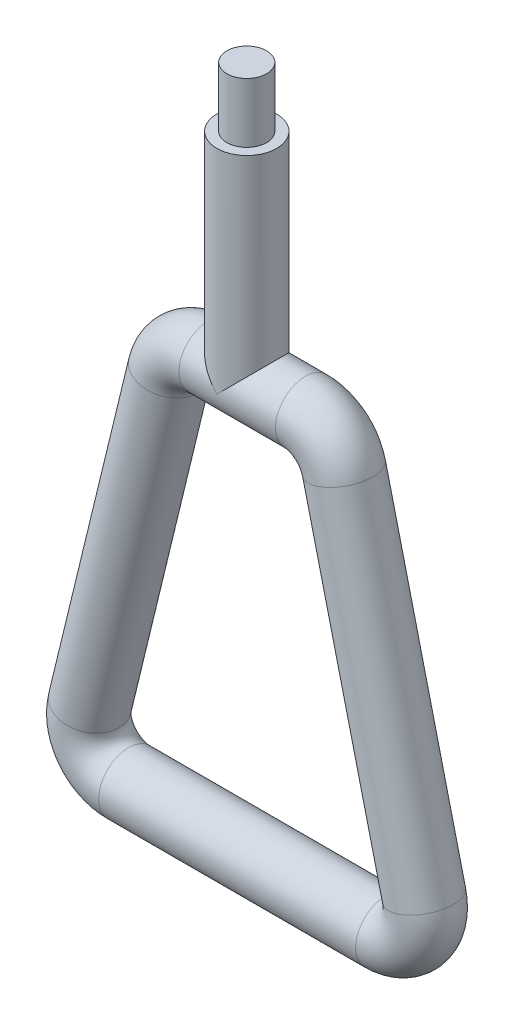
ISO-10303-21;
HEADER;
FILE_DESCRIPTION(('STEP AP214'),'2;1');
FILE_NAME('part.step','',(''),(''),'','','');
FILE_SCHEMA(('AUTOMOTIVE_DESIGN { 1 0 10303 214 1 1 1 1 }'));
ENDSEC;
DATA;
#1=APPLICATION_CONTEXT('core data for automotive mechanical design processes');
#2=APPLICATION_PROTOCOL_DEFINITION('international standard','automotive_design',2000,#1);
#3=PRODUCT_CONTEXT('',#1,'mechanical');
#4=PRODUCT('Part','Part','',(#3));
#5=PRODUCT_RELATED_PRODUCT_CATEGORY('part','',(#4));
#6=PRODUCT_DEFINITION_FORMATION('','',#4);
#7=PRODUCT_DEFINITION_CONTEXT('part definition',#1,'design');
#8=PRODUCT_DEFINITION('design','',#6,#7);
#9=PRODUCT_DEFINITION_SHAPE('','',#8);
#10=(LENGTH_UNIT() NAMED_UNIT(*) SI_UNIT(.MILLI.,.METRE.));
#11=(NAMED_UNIT(*) PLANE_ANGLE_UNIT() SI_UNIT($,.RADIAN.));
#12=(NAMED_UNIT(*) SI_UNIT($,.STERADIAN.) SOLID_ANGLE_UNIT());
#13=UNCERTAINTY_MEASURE_WITH_UNIT(LENGTH_MEASURE(1.E-05),#10,'distance_accuracy_value','');
#14=(GEOMETRIC_REPRESENTATION_CONTEXT(3) GLOBAL_UNCERTAINTY_ASSIGNED_CONTEXT((#13)) GLOBAL_UNIT_ASSIGNED_CONTEXT((#10,
#11,#12)) REPRESENTATION_CONTEXT('',''));
#15=CARTESIAN_POINT('',(0.,0.,0.));
#16=DIRECTION('',(0.,0.,1.));
#17=DIRECTION('',(1.,0.,0.));
#18=AXIS2_PLACEMENT_3D('',#15,#16,#17);
#19=CARTESIAN_POINT('',(0.,-59.001,0.));
#20=DIRECTION('',(0.,1.,0.));
#21=DIRECTION('',(0.,0.,1.));
#22=AXIS2_PLACEMENT_3D('',#19,#20,#21);
#23=CYLINDRICAL_SURFACE('',#22,7.5);
#24=CARTESIAN_POINT('',(0.,51.5,0.));
#25=DIRECTION('',(-0.707106781186547,0.707106781186548,0.));
#26=DIRECTION('',(0.707106781186548,0.707106781186547,0.));
#27=AXIS2_PLACEMENT_3D('',#24,#25,#26);
#28=ELLIPSE('',#27,10.6066017177982,7.5);
#29=CARTESIAN_POINT('',(0.,51.5,7.5));
#30=VERTEX_POINT('',#29);
#31=CARTESIAN_POINT('',(0.,51.5,-7.5));
#32=VERTEX_POINT('',#31);
#33=EDGE_CURVE('E61',#30,#32,#28,.T.);
#34=ORIENTED_EDGE('',*,*,#33,.T.);
#35=CARTESIAN_POINT('',(0.,51.5,0.));
#36=DIRECTION('',(0.707106781186548,0.707106781186547,0.));
#37=DIRECTION('',(-0.707106781186547,0.707106781186548,0.));
#38=AXIS2_PLACEMENT_3D('',#35,#36,#37);
#39=ELLIPSE('',#38,10.6066017177982,7.5);
#40=EDGE_CURVE('E59',#32,#30,#39,.T.);
#41=ORIENTED_EDGE('',*,*,#40,.T.);
#42=EDGE_LOOP('',(#34,#41));
#43=FACE_BOUND('',#42,.T.);
#44=CARTESIAN_POINT('',(0.,105.,0.));
#45=DIRECTION('',(0.,1.,0.));
#46=DIRECTION('',(0.,0.,1.));
#47=AXIS2_PLACEMENT_3D('',#44,#45,#46);
#48=CIRCLE('',#47,7.5);
#49=CARTESIAN_POINT('',(0.,105.,7.5));
#50=VERTEX_POINT('',#49);
#51=EDGE_CURVE('E64',#50,#50,#48,.T.);
#52=ORIENTED_EDGE('',*,*,#51,.F.);
#53=EDGE_LOOP('',(#52));
#54=FACE_BOUND('',#53,.T.);
#55=ADVANCED_FACE('F45',(#43,#54),#23,.T.);
#56=CARTESIAN_POINT('',(-39.4322241420842,-39.1412995011152,0.));
#57=DIRECTION('',(0.235870049888483,0.971784605540551,0.));
#58=DIRECTION('',(-0.971784605540551,0.235870049888483,0.));
#59=AXIS2_PLACEMENT_3D('',#56,#57,#58);
#60=CYLINDRICAL_SURFACE('',#59,7.5);
#61=CARTESIAN_POINT('',(-19.286593074123,43.8587004988848,0.));
#62=DIRECTION('',(-0.235870049888484,-0.971784605540551,0.));
#63=DIRECTION('',(0.971784605540551,-0.235870049888484,0.));
#64=AXIS2_PLACEMENT_3D('',#61,#62,#63);
#65=CIRCLE('',#64,7.5);
#66=CARTESIAN_POINT('',(-26.5749776156771,45.6277258730484,0.));
#67=VERTEX_POINT('',#66);
#68=EDGE_CURVE('E71',#67,#67,#65,.T.);
#69=ORIENTED_EDGE('',*,*,#68,.T.);
#70=EDGE_LOOP('',(#69));
#71=FACE_BOUND('',#70,.T.);
#72=CARTESIAN_POINT('',(-39.4322241420842,-39.1412995011152,0.));
#73=DIRECTION('',(-0.235870049888484,-0.971784605540551,0.));
#74=DIRECTION('',(0.971784605540551,-0.235870049888484,0.));
#75=AXIS2_PLACEMENT_3D('',#72,#73,#74);
#76=CIRCLE('',#75,7.5);
#77=CARTESIAN_POINT('',(-46.7206086836383,-37.3722741269516,0.));
#78=VERTEX_POINT('',#77);
#79=EDGE_CURVE('E68',#78,#78,#76,.T.);
#80=ORIENTED_EDGE('',*,*,#79,.F.);
#81=EDGE_LOOP('',(#80));
#82=FACE_BOUND('',#81,.T.);
#83=ADVANCED_FACE('F107',(#71,#82),#60,.T.);
#84=CARTESIAN_POINT('',(-9.56874701871749,41.5,0.));
#85=DIRECTION('',(0.,0.,-1.));
#86=DIRECTION('',(-1.,0.,0.));
#87=AXIS2_PLACEMENT_3D('',#84,#85,#86);
#88=TOROIDAL_SURFACE('',#87,10.,7.5);
#89=CARTESIAN_POINT('',(-9.5687470187175,51.5,0.));
#90=DIRECTION('',(-1.,0.,0.));
#91=DIRECTION('',(0.,-1.,0.));
#92=AXIS2_PLACEMENT_3D('',#89,#90,#91);
#93=CIRCLE('',#92,7.5);
#94=CARTESIAN_POINT('',(-9.56874701871751,59.,0.));
#95=VERTEX_POINT('',#94);
#96=EDGE_CURVE('E78',#95,#95,#93,.T.);
#97=CARTESIAN_POINT('',(-9.56874701871749,41.5,0.));
#98=DIRECTION('',(0.,0.,-1.));
#99=DIRECTION('',(-1.,0.,0.));
#100=AXIS2_PLACEMENT_3D('',#97,#98,#99);
#101=CIRCLE('',#100,17.5);
#102=EDGE_CURVE('',#67,#95,#101,.T.);
#103=ORIENTED_EDGE('',*,*,#68,.F.);
#104=ORIENTED_EDGE('',*,*,#96,.T.);
#105=ORIENTED_EDGE('',*,*,#102,.T.);
#106=ORIENTED_EDGE('',*,*,#102,.F.);
#107=EDGE_LOOP('',(#103,#105,#104,#106));
#108=FACE_BOUND('',#107,.T.);
#109=ADVANCED_FACE('F112',(#108),#88,.T.);
#110=CARTESIAN_POINT('',(-9.5687470187175,51.5,0.));
#111=DIRECTION('',(1.,0.,0.));
#112=DIRECTION('',(0.,1.,0.));
#113=AXIS2_PLACEMENT_3D('',#110,#111,#112);
#114=CYLINDRICAL_SURFACE('',#113,7.5);
#115=ORIENTED_EDGE('',*,*,#33,.F.);
#116=ORIENTED_EDGE('',*,*,#40,.F.);
#117=EDGE_LOOP('',(#115,#116));
#118=FACE_BOUND('',#117,.T.);
#119=CARTESIAN_POINT('',(14.7049295603332,51.5,0.));
#120=DIRECTION('',(-1.,0.,0.));
#121=DIRECTION('',(0.,-1.,0.));
#122=AXIS2_PLACEMENT_3D('',#119,#120,#121);
#123=CIRCLE('',#122,7.5);
#124=CARTESIAN_POINT('',(14.7049295603332,59.,0.));
#125=VERTEX_POINT('',#124);
#126=EDGE_CURVE('E81',#125,#125,#123,.T.);
#127=ORIENTED_EDGE('',*,*,#126,.T.);
#128=EDGE_LOOP('',(#127));
#129=FACE_BOUND('',#128,.T.);
#130=ORIENTED_EDGE('',*,*,#96,.F.);
#131=EDGE_LOOP('',(#130));
#132=FACE_BOUND('',#131,.T.);
#133=ADVANCED_FACE('F66',(#118,#129,#132),#114,.T.);
#134=CARTESIAN_POINT('',(14.7049295603332,41.5,0.));
#135=DIRECTION('',(0.,0.,-1.));
#136=DIRECTION('',(-1.,0.,0.));
#137=AXIS2_PLACEMENT_3D('',#134,#135,#136);
#138=TOROIDAL_SURFACE('',#137,9.99999999999999,7.5);
#139=CARTESIAN_POINT('',(24.4227756157387,43.8587004988848,0.));
#140=DIRECTION('',(-0.235870049888483,0.971784605540551,0.));
#141=DIRECTION('',(-0.971784605540551,-0.235870049888483,0.));
#142=AXIS2_PLACEMENT_3D('',#139,#140,#141);
#143=CIRCLE('',#142,7.5);
#144=CARTESIAN_POINT('',(31.7111601572929,45.6277258730485,0.));
#145=VERTEX_POINT('',#144);
#146=EDGE_CURVE('E84',#145,#145,#143,.T.);
#147=CARTESIAN_POINT('',(14.7049295603332,41.5,0.));
#148=DIRECTION('',(0.,0.,-1.));
#149=DIRECTION('',(-1.,0.,0.));
#150=AXIS2_PLACEMENT_3D('',#147,#148,#149);
#151=CIRCLE('',#150,17.5);
#152=EDGE_CURVE('',#125,#145,#151,.T.);
#153=ORIENTED_EDGE('',*,*,#126,.F.);
#154=ORIENTED_EDGE('',*,*,#146,.T.);
#155=ORIENTED_EDGE('',*,*,#152,.T.);
#156=ORIENTED_EDGE('',*,*,#152,.F.);
#157=EDGE_LOOP('',(#153,#155,#154,#156));
#158=FACE_BOUND('',#157,.T.);
#159=ADVANCED_FACE('F124',(#158),#138,.T.);
#160=CARTESIAN_POINT('',(24.4227756157387,43.8587004988848,0.));
#161=DIRECTION('',(0.235870049888483,-0.971784605540551,0.));
#162=DIRECTION('',(0.971784605540551,0.235870049888483,0.));
#163=AXIS2_PLACEMENT_3D('',#160,#161,#162);
#164=CYLINDRICAL_SURFACE('',#163,7.5);
#165=CARTESIAN_POINT('',(44.5684066836999,-39.1412995011151,0.));
#166=DIRECTION('',(-0.235870049888483,0.971784605540551,0.));
#167=DIRECTION('',(-0.971784605540551,-0.235870049888483,0.));
#168=AXIS2_PLACEMENT_3D('',#165,#166,#167);
#169=CIRCLE('',#168,7.5);
#170=CARTESIAN_POINT('',(51.856791225254,-37.3722741269515,0.));
#171=VERTEX_POINT('',#170);
#172=EDGE_CURVE('E87',#171,#171,#169,.T.);
#173=ORIENTED_EDGE('',*,*,#172,.T.);
#174=EDGE_LOOP('',(#173));
#175=FACE_BOUND('',#174,.T.);
#176=ORIENTED_EDGE('',*,*,#146,.F.);
#177=EDGE_LOOP('',(#176));
#178=FACE_BOUND('',#177,.T.);
#179=ADVANCED_FACE('F104',(#175,#178),#164,.T.);
#180=CARTESIAN_POINT('',(34.8505606282944,-41.5,0.));
#181=DIRECTION('',(0.,0.,-1.));
#182=DIRECTION('',(-1.,0.,0.));
#183=AXIS2_PLACEMENT_3D('',#180,#181,#182);
#184=TOROIDAL_SURFACE('',#183,10.,7.5);
#185=CARTESIAN_POINT('',(34.8505606282944,-51.5,0.));
#186=DIRECTION('',(1.,0.,0.));
#187=DIRECTION('',(0.,1.,0.));
#188=AXIS2_PLACEMENT_3D('',#185,#186,#187);
#189=CIRCLE('',#188,7.5);
#190=CARTESIAN_POINT('',(34.8505606282944,-59.,0.));
#191=VERTEX_POINT('',#190);
#192=EDGE_CURVE('E53',#191,#191,#189,.T.);
#193=CARTESIAN_POINT('',(34.8505606282944,-41.5,0.));
#194=DIRECTION('',(0.,0.,-1.));
#195=DIRECTION('',(-1.,0.,0.));
#196=AXIS2_PLACEMENT_3D('',#193,#194,#195);
#197=CIRCLE('',#196,17.5);
#198=EDGE_CURVE('',#171,#191,#197,.T.);
#199=ORIENTED_EDGE('',*,*,#172,.F.);
#200=ORIENTED_EDGE('',*,*,#192,.T.);
#201=ORIENTED_EDGE('',*,*,#198,.T.);
#202=ORIENTED_EDGE('',*,*,#198,.F.);
#203=EDGE_LOOP('',(#199,#201,#200,#202));
#204=FACE_BOUND('',#203,.T.);
#205=ADVANCED_FACE('F92',(#204),#184,.T.);
#206=CARTESIAN_POINT('',(34.8505606282944,-51.5,0.));
#207=DIRECTION('',(-1.,0.,0.));
#208=DIRECTION('',(0.,-1.,0.));
#209=AXIS2_PLACEMENT_3D('',#206,#207,#208);
#210=CYLINDRICAL_SURFACE('',#209,7.5);
#211=CARTESIAN_POINT('',(-29.7143780866786,-51.5,0.));
#212=DIRECTION('',(1.,0.,0.));
#213=DIRECTION('',(0.,1.,0.));
#214=AXIS2_PLACEMENT_3D('',#211,#212,#213);
#215=CIRCLE('',#214,7.5);
#216=CARTESIAN_POINT('',(-29.7143780866786,-59.,0.));
#217=VERTEX_POINT('',#216);
#218=EDGE_CURVE('E12',#217,#217,#215,.T.);
#219=ORIENTED_EDGE('',*,*,#218,.T.);
#220=EDGE_LOOP('',(#219));
#221=FACE_BOUND('',#220,.T.);
#222=ORIENTED_EDGE('',*,*,#192,.F.);
#223=EDGE_LOOP('',(#222));
#224=FACE_BOUND('',#223,.T.);
#225=ADVANCED_FACE('F95',(#221,#224),#210,.T.);
#226=CARTESIAN_POINT('',(-29.7143780866786,-41.5,0.));
#227=DIRECTION('',(0.,0.,-1.));
#228=DIRECTION('',(-1.,0.,0.));
#229=AXIS2_PLACEMENT_3D('',#226,#227,#228);
#230=TOROIDAL_SURFACE('',#229,10.,7.5);
#231=CARTESIAN_POINT('',(-29.7143780866786,-41.5,0.));
#232=DIRECTION('',(0.,0.,-1.));
#233=DIRECTION('',(-1.,0.,0.));
#234=AXIS2_PLACEMENT_3D('',#231,#232,#233);
#235=CIRCLE('',#234,17.5);
#236=EDGE_CURVE('',#217,#78,#235,.T.);
#237=ORIENTED_EDGE('',*,*,#218,.F.);
#238=ORIENTED_EDGE('',*,*,#79,.T.);
#239=ORIENTED_EDGE('',*,*,#236,.T.);
#240=ORIENTED_EDGE('',*,*,#236,.F.);
#241=EDGE_LOOP('',(#237,#239,#238,#240));
#242=FACE_BOUND('',#241,.T.);
#243=ADVANCED_FACE('F47',(#242),#230,.T.);
#244=CARTESIAN_POINT('',(0.,105.,0.));
#245=DIRECTION('',(0.,1.,0.));
#246=DIRECTION('',(0.,0.,1.));
#247=AXIS2_PLACEMENT_3D('',#244,#245,#246);
#248=PLANE('',#247);
#249=CARTESIAN_POINT('',(0.,105.,0.));
#250=DIRECTION('',(0.,1.,0.));
#251=DIRECTION('',(0.,0.,1.));
#252=AXIS2_PLACEMENT_3D('',#249,#250,#251);
#253=CIRCLE('',#252,5.);
#254=CARTESIAN_POINT('',(0.,105.,5.));
#255=VERTEX_POINT('',#254);
#256=EDGE_CURVE('E207',#255,#255,#253,.T.);
#257=ORIENTED_EDGE('',*,*,#256,.F.);
#258=EDGE_LOOP('',(#257));
#259=FACE_BOUND('',#258,.T.);
#260=ORIENTED_EDGE('',*,*,#51,.T.);
#261=EDGE_LOOP('',(#260));
#262=FACE_BOUND('',#261,.T.);
#263=ADVANCED_FACE('F102',(#259,#262),#248,.T.);
#264=CARTESIAN_POINT('',(0.,105.,0.));
#265=DIRECTION('',(0.,1.,0.));
#266=DIRECTION('',(0.,0.,1.));
#267=AXIS2_PLACEMENT_3D('',#264,#265,#266);
#268=CYLINDRICAL_SURFACE('',#267,5.);
#269=ORIENTED_EDGE('',*,*,#256,.T.);
#270=EDGE_LOOP('',(#269));
#271=FACE_BOUND('',#270,.T.);
#272=CARTESIAN_POINT('',(0.,120.,0.));
#273=DIRECTION('',(0.,1.,0.));
#274=DIRECTION('',(0.,0.,1.));
#275=AXIS2_PLACEMENT_3D('',#272,#273,#274);
#276=CIRCLE('',#275,5.);
#277=CARTESIAN_POINT('',(0.,120.,5.));
#278=VERTEX_POINT('',#277);
#279=EDGE_CURVE('E205',#278,#278,#276,.T.);
#280=ORIENTED_EDGE('',*,*,#279,.F.);
#281=EDGE_LOOP('',(#280));
#282=FACE_BOUND('',#281,.T.);
#283=ADVANCED_FACE('F183',(#271,#282),#268,.T.);
#284=CARTESIAN_POINT('',(0.,120.,0.));
#285=DIRECTION('',(0.,1.,0.));
#286=DIRECTION('',(0.,0.,1.));
#287=AXIS2_PLACEMENT_3D('',#284,#285,#286);
#288=PLANE('',#287);
#289=ORIENTED_EDGE('',*,*,#279,.T.);
#290=EDGE_LOOP('',(#289));
#291=FACE_BOUND('',#290,.T.);
#292=ADVANCED_FACE('F116',(#291),#288,.T.);
#293=CLOSED_SHELL('',(#55,#83,#109,#133,#159,#179,#205,#225,#243,#263,#283,#292));
#294=MANIFOLD_SOLID_BREP('B2',#293);
#295=ADVANCED_BREP_SHAPE_REPRESENTATION('',(#18,#294),#14);
#296=SHAPE_DEFINITION_REPRESENTATION(#9,#295);
ENDSEC;
END-ISO-10303-21;
